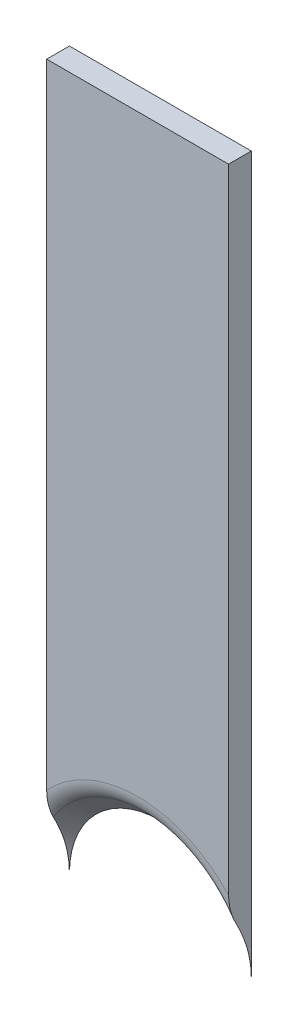
ISO-10303-21;
HEADER;
FILE_DESCRIPTION(('STEP AP214'),'2;1');
FILE_NAME('part.step','',(''),(''),'','','');
FILE_SCHEMA(('AUTOMOTIVE_DESIGN { 1 0 10303 214 1 1 1 1 }'));
ENDSEC;
DATA;
#1=APPLICATION_CONTEXT('core data for automotive mechanical design processes');
#2=APPLICATION_PROTOCOL_DEFINITION('international standard','automotive_design',2000,#1);
#3=PRODUCT_CONTEXT('',#1,'mechanical');
#4=PRODUCT('Part','Part','',(#3));
#5=PRODUCT_RELATED_PRODUCT_CATEGORY('part','',(#4));
#6=PRODUCT_DEFINITION_FORMATION('','',#4);
#7=PRODUCT_DEFINITION_CONTEXT('part definition',#1,'design');
#8=PRODUCT_DEFINITION('design','',#6,#7);
#9=PRODUCT_DEFINITION_SHAPE('','',#8);
#10=(LENGTH_UNIT() NAMED_UNIT(*) SI_UNIT(.MILLI.,.METRE.));
#11=(NAMED_UNIT(*) PLANE_ANGLE_UNIT() SI_UNIT($,.RADIAN.));
#12=(NAMED_UNIT(*) SI_UNIT($,.STERADIAN.) SOLID_ANGLE_UNIT());
#13=UNCERTAINTY_MEASURE_WITH_UNIT(LENGTH_MEASURE(1.E-05),#10,'distance_accuracy_value','');
#14=(GEOMETRIC_REPRESENTATION_CONTEXT(3) GLOBAL_UNCERTAINTY_ASSIGNED_CONTEXT((#13)) GLOBAL_UNIT_ASSIGNED_CONTEXT((#10,
#11,#12)) REPRESENTATION_CONTEXT('',''));
#15=CARTESIAN_POINT('',(0.,0.,0.));
#16=DIRECTION('',(0.,0.,1.));
#17=DIRECTION('',(1.,0.,0.));
#18=AXIS2_PLACEMENT_3D('',#15,#16,#17);
#19=CARTESIAN_POINT('',(40.,-180.,10.));
#20=DIRECTION('',(-1.,0.,0.));
#21=DIRECTION('',(0.,0.,1.));
#22=AXIS2_PLACEMENT_3D('',#19,#20,#21);
#23=PLANE('',#22);
#24=DIRECTION('',(0.,1.,0.));
#25=VECTOR('',#24,1.);
#26=CARTESIAN_POINT('',(40.,-180.,10.));
#27=LINE('',#26,#25);
#28=CARTESIAN_POINT('',(40.,-98.5120451395467,10.));
#29=VERTEX_POINT('',#28);
#30=CARTESIAN_POINT('',(40.,180.,10.));
#31=VERTEX_POINT('',#30);
#32=EDGE_CURVE('E104',#29,#31,#27,.T.);
#33=ORIENTED_EDGE('',*,*,#32,.F.);
#34=CARTESIAN_POINT('',(40.,-98.5120451395467,10.));
#35=CARTESIAN_POINT('',(40.,-98.8548443335666,9.99998763710663));
#36=CARTESIAN_POINT('',(40.,-99.1976098874552,9.99199448702857));
#37=CARTESIAN_POINT('',(40.,-99.8823851410173,9.96070157282316));
#38=CARTESIAN_POINT('',(40.,-100.224394964247,9.93740453048405));
#39=CARTESIAN_POINT('',(40.,-100.90696832693,9.87616946586262));
#40=CARTESIAN_POINT('',(40.,-101.247532347346,9.83823677389069));
#41=CARTESIAN_POINT('',(40.,-101.926790714077,9.74828860130499));
#42=CARTESIAN_POINT('',(40.,-102.265484966081,9.69627241682817));
#43=CARTESIAN_POINT('',(40.,-103.265715393115,9.521988811708));
#44=CARTESIAN_POINT('',(40.,-103.923953481713,9.38031676212381));
#45=CARTESIAN_POINT('',(40.,-105.227642174539,9.04741913689724));
#46=CARTESIAN_POINT('',(40.,-105.873094552087,8.8562004856856));
#47=CARTESIAN_POINT('',(40.,-106.824803139328,8.53456826028651));
#48=CARTESIAN_POINT('',(40.,-107.137320531388,8.42239393716112));
#49=CARTESIAN_POINT('',(40.,-107.757852907866,8.18624177152472));
#50=CARTESIAN_POINT('',(40.,-108.065868270257,8.0622649265523));
#51=CARTESIAN_POINT('',(40.,-108.679574261328,7.80120729509383));
#52=CARTESIAN_POINT('',(40.,-108.985219124466,7.66401876223868));
#53=CARTESIAN_POINT('',(40.,-109.590694856589,7.3770626827442));
#54=CARTESIAN_POINT('',(40.,-109.890523278456,7.2272899771016));
#55=CARTESIAN_POINT('',(40.,-110.186990812293,7.07106781186548));
#56=B_SPLINE_CURVE_WITH_KNOTS('',3,(#34,#35,#36,#37,#38,#39,#40,#41,#42,#43,#44,#45,#46,#47,#48,
#49,#50,#51,#52,#53,#54,#55),.UNSPECIFIED.,.F.,.F.,(4,2,2,2,2,2,2,2,2,2,4),(0.,1.02825490576457,
2.05632698649179,3.08402499578559,4.11177437672876,6.12955920371008,8.14706218528087,
9.14298293843198,10.1388195918573,11.1436053148283,12.1488049882797),.UNSPECIFIED.);
#57=CARTESIAN_POINT('',(40.,-110.186990812293,7.07106781186547));
#58=VERTEX_POINT('',#57);
#59=EDGE_CURVE('E63',#29,#58,#56,.T.);
#60=ORIENTED_EDGE('',*,*,#59,.T.);
#61=CARTESIAN_POINT('',(40.,-105.,10.));
#62=CARTESIAN_POINT('',(40.,-105.723684167021,9.56584719959205));
#63=CARTESIAN_POINT('',(40.,-106.451803617257,9.13897605937987));
#64=CARTESIAN_POINT('',(40.,-107.91782228466,8.30197283507771));
#65=CARTESIAN_POINT('',(40.,-108.655723806052,7.89184479118897));
#66=CARTESIAN_POINT('',(40.,-110.144451058288,7.0893222466893));
#67=CARTESIAN_POINT('',(40.,-110.895312785709,6.69699431100021));
#68=CARTESIAN_POINT('',(40.,-112.408109055509,5.93437408943799));
#69=CARTESIAN_POINT('',(40.,-113.170042817666,5.56408026014897));
#70=CARTESIAN_POINT('',(40.,-114.68596255137,4.85779749372955));
#71=CARTESIAN_POINT('',(40.,-115.439651202122,4.52117231570187));
#72=CARTESIAN_POINT('',(40.,-116.958662738706,3.87501987882566));
#73=CARTESIAN_POINT('',(40.,-117.723986466339,3.56549459171623));
#74=CARTESIAN_POINT('',(40.,-119.265430144066,2.97755027429905));
#75=CARTESIAN_POINT('',(40.,-120.041535145974,2.6990922321071));
#76=CARTESIAN_POINT('',(40.,-121.605208341393,2.17674151839254));
#77=CARTESIAN_POINT('',(40.,-122.392774864063,1.93284386328672));
#78=CARTESIAN_POINT('',(40.,-124.13871186519,1.43830056462948));
#79=CARTESIAN_POINT('',(40.,-125.099526902518,1.19619516285629));
#80=CARTESIAN_POINT('',(40.,-127.034841436779,0.774414168237882));
#81=CARTESIAN_POINT('',(40.,-128.00933919393,0.594730711797209));
#82=CARTESIAN_POINT('',(40.,-129.485891063378,0.375280318976218));
#83=CARTESIAN_POINT('',(40.,-129.98427601013,0.310186103403029));
#84=CARTESIAN_POINT('',(40.,-130.983096309736,0.198126279878736));
#85=CARTESIAN_POINT('',(40.,-131.483531629964,0.151160384582433));
#86=CARTESIAN_POINT('',(40.,-132.486262114707,0.0757888742831074));
#87=CARTESIAN_POINT('',(40.,-132.988558568967,0.0474004193727807));
#88=CARTESIAN_POINT('',(40.,-133.993899965533,0.00948908047045268));
#89=CARTESIAN_POINT('',(40.,-134.496944962002,-3.23645759774494E-05));
#90=CARTESIAN_POINT('',(40.,-135.,0.));
#91=B_SPLINE_CURVE_WITH_KNOTS('',3,(#61,#62,#63,#64,#65,#66,#67,#68,#69,#70,#71,#72,#73,#74,#75,
#76,#77,#78,#79,#80,#81,#82,#83,#84,#85,#86,#87,#88,#89,#90),.UNSPECIFIED.,.F.,.F.,(4,2,2,2,2,2,
2,2,2,2,2,2,2,2,4),(0.,2.53181371576712,5.06423480383857,7.60545461653151,10.1464962151749,
12.6223692160408,15.0984222075118,17.5713301077036,20.0438810526644,23.0145745118417,
25.9848936025235,27.4924698632513,29.0000222269724,30.5089651675482,32.0180231874724),.UNSPECIFIED.);
#92=CARTESIAN_POINT('',(40.,-135.,0.));
#93=VERTEX_POINT('',#92);
#94=EDGE_CURVE('E83',#58,#93,#91,.T.);
#95=ORIENTED_EDGE('',*,*,#94,.T.);
#96=DIRECTION('',(0.,1.,0.));
#97=VECTOR('',#96,1.);
#98=CARTESIAN_POINT('',(40.,-180.,0.));
#99=LINE('',#98,#97);
#100=CARTESIAN_POINT('',(40.,180.,0.));
#101=VERTEX_POINT('',#100);
#102=EDGE_CURVE('E86',#93,#101,#99,.T.);
#103=ORIENTED_EDGE('',*,*,#102,.T.);
#104=DIRECTION('',(0.,0.,-1.));
#105=VECTOR('',#104,1.);
#106=CARTESIAN_POINT('',(40.,180.,10.));
#107=LINE('',#106,#105);
#108=EDGE_CURVE('E117',#31,#101,#107,.T.);
#109=ORIENTED_EDGE('',*,*,#108,.F.);
#110=EDGE_LOOP('',(#33,#60,#95,#103,#109));
#111=FACE_BOUND('',#110,.T.);
#112=ADVANCED_FACE('F35',(#111),#23,.F.);
#113=CARTESIAN_POINT('',(-40.,180.,10.));
#114=DIRECTION('',(0.,-1.,0.));
#115=DIRECTION('',(0.,0.,-1.));
#116=AXIS2_PLACEMENT_3D('',#113,#114,#115);
#117=PLANE('',#116);
#118=DIRECTION('',(-1.,0.,0.));
#119=VECTOR('',#118,1.);
#120=CARTESIAN_POINT('',(-40.,180.,0.));
#121=LINE('',#120,#119);
#122=CARTESIAN_POINT('',(-40.,180.,0.));
#123=VERTEX_POINT('',#122);
#124=EDGE_CURVE('E98',#101,#123,#121,.T.);
#125=ORIENTED_EDGE('',*,*,#124,.T.);
#126=DIRECTION('',(0.,0.,-1.));
#127=VECTOR('',#126,1.);
#128=CARTESIAN_POINT('',(-40.,180.,10.));
#129=LINE('',#128,#127);
#130=CARTESIAN_POINT('',(-40.,180.,10.));
#131=VERTEX_POINT('',#130);
#132=EDGE_CURVE('E111',#131,#123,#129,.T.);
#133=ORIENTED_EDGE('',*,*,#132,.F.);
#134=DIRECTION('',(-1.,0.,0.));
#135=VECTOR('',#134,1.);
#136=CARTESIAN_POINT('',(-40.,180.,10.));
#137=LINE('',#136,#135);
#138=EDGE_CURVE('E106',#31,#131,#137,.T.);
#139=ORIENTED_EDGE('',*,*,#138,.F.);
#140=ORIENTED_EDGE('',*,*,#108,.T.);
#141=EDGE_LOOP('',(#125,#133,#139,#140));
#142=FACE_BOUND('',#141,.T.);
#143=ADVANCED_FACE('F137',(#142),#117,.F.);
#144=CARTESIAN_POINT('',(-40.,-180.,10.));
#145=DIRECTION('',(1.,0.,0.));
#146=DIRECTION('',(0.,0.,-1.));
#147=AXIS2_PLACEMENT_3D('',#144,#145,#146);
#148=PLANE('',#147);
#149=CARTESIAN_POINT('',(-40.,-135.,0.));
#150=CARTESIAN_POINT('',(-40.,-134.69257143711,-2.97002326431577E-06));
#151=CARTESIAN_POINT('',(-40.,-134.385154106107,0.00354474413591057));
#152=CARTESIAN_POINT('',(-40.,-133.770486584723,0.0177128144668288));
#153=CARTESIAN_POINT('',(-40.,-133.46323639211,0.0283330737201724));
#154=CARTESIAN_POINT('',(-40.,-132.542076501429,0.0707534821829216));
#155=CARTESIAN_POINT('',(-40.,-131.928621611857,0.113113286796892));
#156=CARTESIAN_POINT('',(-40.,-130.705436856263,0.225277870124812));
#157=CARTESIAN_POINT('',(-40.,-130.095702125242,0.295030310315419));
#158=CARTESIAN_POINT('',(-40.,-128.879836528922,0.461014342468216));
#159=CARTESIAN_POINT('',(-40.,-128.273705777478,0.557246766475864));
#160=CARTESIAN_POINT('',(-40.,-127.076126957723,0.773112278658128));
#161=CARTESIAN_POINT('',(-40.,-126.484603061991,0.892326170138089));
#162=CARTESIAN_POINT('',(-40.,-125.306635469962,1.15375231122866));
#163=CARTESIAN_POINT('',(-40.,-124.720192260388,1.29596673914483));
#164=CARTESIAN_POINT('',(-40.,-122.969038603033,1.75494304634801));
#165=CARTESIAN_POINT('',(-40.,-121.812712644489,2.10399941230828));
#166=CARTESIAN_POINT('',(-40.,-119.308401258059,2.94861843704855));
#167=CARTESIAN_POINT('',(-40.,-117.965599025133,3.45940810665252));
#168=CARTESIAN_POINT('',(-40.,-115.977812414349,4.28861079665755));
#169=CARTESIAN_POINT('',(-40.,-115.319422521184,4.5756120646528));
#170=CARTESIAN_POINT('',(-40.,-114.011188985528,5.16846384246629));
#171=CARTESIAN_POINT('',(-40.,-113.361345012947,5.47431362163971));
#172=CARTESIAN_POINT('',(-40.,-112.056168576857,6.10951655753463));
#173=CARTESIAN_POINT('',(-40.,-111.40101251667,6.4392308552325));
#174=CARTESIAN_POINT('',(-40.,-110.098802165865,7.11432586939521));
#175=CARTESIAN_POINT('',(-40.,-109.451748192076,7.45970719608478));
#176=CARTESIAN_POINT('',(-40.,-108.166411966362,8.16381054447246));
#177=CARTESIAN_POINT('',(-40.,-107.528116487173,8.52250847809723));
#178=CARTESIAN_POINT('',(-40.,-106.258769293252,9.25230530329803));
#179=CARTESIAN_POINT('',(-40.,-105.62771656542,9.62340243138879));
#180=CARTESIAN_POINT('',(-40.,-105.,10.));
#181=B_SPLINE_CURVE_WITH_KNOTS('',3,(#149,#150,#151,#152,#153,#154,#155,#156,#157,#158,#159,
#160,#161,#162,#163,#164,#165,#166,#167,#168,#169,#170,#171,#172,#173,#174,#175,#176,#177,#178,
#179,#180),.UNSPECIFIED.,.F.,.F.,(4,2,2,2,2,2,2,2,2,2,2,2,2,2,2,4),(0.,0.922243010848142,
1.84447338402817,3.68852688531529,5.52907400272558,7.36967895981553,9.17943744430086,
10.9893674255657,14.6098618652875,18.9161272894409,21.0705770938193,23.2249434354451,
25.425049988316,27.6252423081918,29.8216320827721,32.0177107927776),.UNSPECIFIED.);
#182=CARTESIAN_POINT('',(-40.,-135.,0.));
#183=VERTEX_POINT('',#182);
#184=CARTESIAN_POINT('',(-40.,-110.186990812284,7.07106781187016));
#185=VERTEX_POINT('',#184);
#186=EDGE_CURVE('E90',#183,#185,#181,.T.);
#187=ORIENTED_EDGE('',*,*,#186,.T.);
#188=CARTESIAN_POINT('',(-39.9999999999931,-110.186990812282,7.07106781186547));
#189=CARTESIAN_POINT('',(-39.9999999999974,-110.027418997081,7.15517967846609));
#190=CARTESIAN_POINT('',(-39.9999999999993,-109.866862563371,7.23740457326223));
#191=CARTESIAN_POINT('',(-40.0000000000007,-109.543918319374,7.39816084809332));
#192=CARTESIAN_POINT('',(-40.0000000000002,-109.38153057987,7.47669237028134));
#193=CARTESIAN_POINT('',(-39.9999999999995,-108.891867821271,7.70684918059426));
#194=CARTESIAN_POINT('',(-39.9999999999999,-108.562035294552,7.85306715645361));
#195=CARTESIAN_POINT('',(-40.0000000000001,-107.896319441149,8.13151434774221));
#196=CARTESIAN_POINT('',(-40.,-107.560432779377,8.2637355587953));
#197=CARTESIAN_POINT('',(-40.,-106.883496146479,8.51425645606922));
#198=CARTESIAN_POINT('',(-40.,-106.542445990778,8.63255564329866));
#199=CARTESIAN_POINT('',(-40.,-105.862624111659,8.85299219227434));
#200=CARTESIAN_POINT('',(-40.,-105.523941370183,8.95540357786523));
#201=CARTESIAN_POINT('',(-40.,-104.842758776517,9.14665054931158));
#202=CARTESIAN_POINT('',(-40.,-104.500258500283,9.23548461056583));
#203=CARTESIAN_POINT('',(-40.,-103.468146516158,9.48111791014186));
#204=CARTESIAN_POINT('',(-40.,-102.773397642788,9.6172190990926));
#205=CARTESIAN_POINT('',(-40.,-101.780946284503,9.76859656321179));
#206=CARTESIAN_POINT('',(-40.,-101.486743569516,9.80816021659054));
#207=CARTESIAN_POINT('',(-40.,-100.897138600383,9.87655196950559));
#208=CARTESIAN_POINT('',(-40.,-100.601736657104,9.90538269145809));
#209=CARTESIAN_POINT('',(-40.,-100.007582709721,9.95213548423034));
#210=CARTESIAN_POINT('',(-40.,-99.7088233536775,9.96996427899597));
#211=CARTESIAN_POINT('',(-40.,-99.1107316977473,9.99389501224975));
#212=CARTESIAN_POINT('',(-40.,-98.8113992318963,9.99999277827486));
#213=CARTESIAN_POINT('',(-40.,-98.5120451395466,10.));
#214=B_SPLINE_CURVE_WITH_KNOTS('',3,(#188,#189,#190,#191,#192,#193,#194,#195,#196,#197,#198,
#199,#200,#201,#202,#203,#204,#205,#206,#207,#208,#209,#210,#211,#212,#213),.UNSPECIFIED.,.F.,
.F.,(4,2,2,2,2,2,2,2,2,2,2,2,4),(0.,0.541120058807116,1.08221927353966,2.16422145496549,
3.24683909932188,4.32949553490985,5.39067784285959,6.45197922383308,8.57292718577309,
9.46334596203274,10.3535470360185,11.2511952522414,12.149162682757),.UNSPECIFIED.);
#215=CARTESIAN_POINT('',(-40.,-98.5120451395467,10.));
#216=VERTEX_POINT('',#215);
#217=EDGE_CURVE('E11',#185,#216,#214,.T.);
#218=ORIENTED_EDGE('',*,*,#217,.T.);
#219=DIRECTION('',(0.,-1.,0.));
#220=VECTOR('',#219,1.);
#221=CARTESIAN_POINT('',(-40.,-180.,10.));
#222=LINE('',#221,#220);
#223=EDGE_CURVE('E109',#131,#216,#222,.T.);
#224=ORIENTED_EDGE('',*,*,#223,.F.);
#225=ORIENTED_EDGE('',*,*,#132,.T.);
#226=DIRECTION('',(0.,-1.,0.));
#227=VECTOR('',#226,1.);
#228=CARTESIAN_POINT('',(-40.,-180.,0.));
#229=LINE('',#228,#227);
#230=EDGE_CURVE('E107',#123,#183,#229,.T.);
#231=ORIENTED_EDGE('',*,*,#230,.T.);
#232=EDGE_LOOP('',(#187,#218,#224,#225,#231));
#233=FACE_BOUND('',#232,.T.);
#234=ADVANCED_FACE('F131',(#233),#148,.F.);
#235=CARTESIAN_POINT('',(0.,0.,10.));
#236=DIRECTION('',(0.,0.,-1.));
#237=DIRECTION('',(-1.,0.,0.));
#238=AXIS2_PLACEMENT_3D('',#235,#236,#237);
#239=PLANE('',#238);
#240=ORIENTED_EDGE('',*,*,#223,.T.);
#241=CARTESIAN_POINT('',(0.,-135.,10.));
#242=DIRECTION('',(0.,0.,-1.));
#243=DIRECTION('',(-1.,0.,0.));
#244=AXIS2_PLACEMENT_3D('',#241,#242,#243);
#245=CIRCLE('',#244,54.142135623731);
#246=EDGE_CURVE('E89',#216,#29,#245,.T.);
#247=ORIENTED_EDGE('',*,*,#246,.T.);
#248=ORIENTED_EDGE('',*,*,#32,.T.);
#249=ORIENTED_EDGE('',*,*,#138,.T.);
#250=EDGE_LOOP('',(#240,#247,#248,#249));
#251=FACE_BOUND('',#250,.T.);
#252=ADVANCED_FACE('F136',(#251),#239,.F.);
#253=CARTESIAN_POINT('',(0.,0.,0.));
#254=DIRECTION('',(0.,0.,-1.));
#255=DIRECTION('',(-1.,0.,0.));
#256=AXIS2_PLACEMENT_3D('',#253,#254,#255);
#257=PLANE('',#256);
#258=CARTESIAN_POINT('',(0.,-135.,0.));
#259=DIRECTION('',(0.,0.,1.));
#260=DIRECTION('',(1.,0.,0.));
#261=AXIS2_PLACEMENT_3D('',#258,#259,#260);
#262=CIRCLE('',#261,40.);
#263=EDGE_CURVE('E96',#93,#183,#262,.T.);
#264=ORIENTED_EDGE('',*,*,#263,.T.);
#265=ORIENTED_EDGE('',*,*,#230,.F.);
#266=ORIENTED_EDGE('',*,*,#124,.F.);
#267=ORIENTED_EDGE('',*,*,#102,.F.);
#268=EDGE_LOOP('',(#264,#265,#266,#267));
#269=FACE_BOUND('',#268,.T.);
#270=ADVANCED_FACE('F94',(#269),#257,.T.);
#271=CARTESIAN_POINT('',(0.,-135.,0.));
#272=DIRECTION('',(0.,0.,1.));
#273=DIRECTION('',(1.,0.,0.));
#274=AXIS2_PLACEMENT_3D('',#271,#272,#273);
#275=CONICAL_SURFACE('',#274,40.,0.785398163397448);
#276=ORIENTED_EDGE('',*,*,#94,.F.);
#277=CARTESIAN_POINT('',(0.,-135.,7.07106781186548));
#278=DIRECTION('',(0.,0.,1.));
#279=DIRECTION('',(1.,0.,0.));
#280=AXIS2_PLACEMENT_3D('',#277,#278,#279);
#281=CIRCLE('',#280,47.0710678118655);
#282=EDGE_CURVE('E49',#58,#185,#281,.T.);
#283=ORIENTED_EDGE('',*,*,#282,.T.);
#284=ORIENTED_EDGE('',*,*,#186,.F.);
#285=ORIENTED_EDGE('',*,*,#263,.F.);
#286=EDGE_LOOP('',(#276,#283,#284,#285));
#287=FACE_BOUND('',#286,.T.);
#288=ADVANCED_FACE('F101',(#287),#275,.F.);
#289=CARTESIAN_POINT('',(0.,-135.,0.));
#290=DIRECTION('',(0.,0.,-1.));
#291=DIRECTION('',(-1.,0.,0.));
#292=AXIS2_PLACEMENT_3D('',#289,#290,#291);
#293=TOROIDAL_SURFACE('',#292,54.142135623731,10.);
#294=ORIENTED_EDGE('',*,*,#217,.F.);
#295=ORIENTED_EDGE('',*,*,#282,.F.);
#296=ORIENTED_EDGE('',*,*,#59,.F.);
#297=ORIENTED_EDGE('',*,*,#246,.F.);
#298=EDGE_LOOP('',(#294,#295,#296,#297));
#299=FACE_BOUND('',#298,.T.);
#300=ADVANCED_FACE('F37',(#299),#293,.T.);
#301=CLOSED_SHELL('',(#112,#143,#234,#252,#270,#288,#300));
#302=MANIFOLD_SOLID_BREP('B2',#301);
#303=ADVANCED_BREP_SHAPE_REPRESENTATION('',(#18,#302),#14);
#304=SHAPE_DEFINITION_REPRESENTATION(#9,#303);
ENDSEC;
END-ISO-10303-21;
